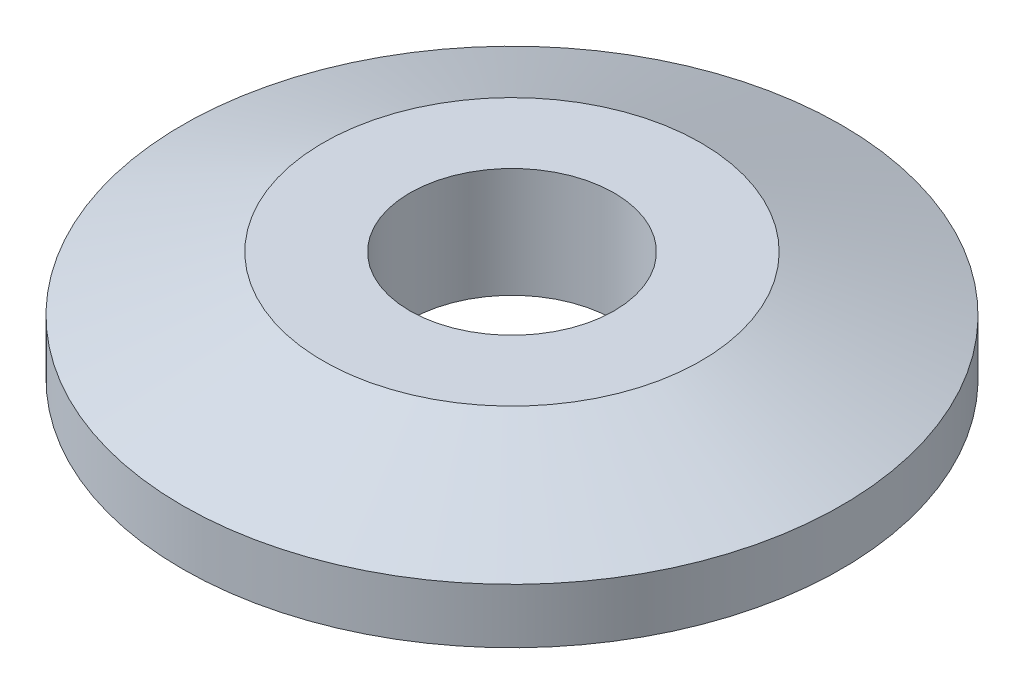
ISO-10303-21;
HEADER;
FILE_DESCRIPTION(('STEP AP214'),'2;1');
FILE_NAME('part.step','',(''),(''),'','','');
FILE_SCHEMA(('AUTOMOTIVE_DESIGN { 1 0 10303 214 1 1 1 1 }'));
ENDSEC;
DATA;
#1=APPLICATION_CONTEXT('core data for automotive mechanical design processes');
#2=APPLICATION_PROTOCOL_DEFINITION('international standard','automotive_design',2000,#1);
#3=PRODUCT_CONTEXT('',#1,'mechanical');
#4=PRODUCT('Part','Part','',(#3));
#5=PRODUCT_RELATED_PRODUCT_CATEGORY('part','',(#4));
#6=PRODUCT_DEFINITION_FORMATION('','',#4);
#7=PRODUCT_DEFINITION_CONTEXT('part definition',#1,'design');
#8=PRODUCT_DEFINITION('design','',#6,#7);
#9=PRODUCT_DEFINITION_SHAPE('','',#8);
#10=(LENGTH_UNIT() NAMED_UNIT(*) SI_UNIT(.MILLI.,.METRE.));
#11=(NAMED_UNIT(*) PLANE_ANGLE_UNIT() SI_UNIT($,.RADIAN.));
#12=(NAMED_UNIT(*) SI_UNIT($,.STERADIAN.) SOLID_ANGLE_UNIT());
#13=UNCERTAINTY_MEASURE_WITH_UNIT(LENGTH_MEASURE(1.E-05),#10,'distance_accuracy_value','');
#14=(GEOMETRIC_REPRESENTATION_CONTEXT(3) GLOBAL_UNCERTAINTY_ASSIGNED_CONTEXT((#13)) GLOBAL_UNIT_ASSIGNED_CONTEXT((#10,
#11,#12)) REPRESENTATION_CONTEXT('',''));
#15=CARTESIAN_POINT('',(0.,0.,0.));
#16=DIRECTION('',(0.,0.,1.));
#17=DIRECTION('',(1.,0.,0.));
#18=AXIS2_PLACEMENT_3D('',#15,#16,#17);
#19=CARTESIAN_POINT('',(0.,5.,0.));
#20=DIRECTION('',(0.,-1.,0.));
#21=DIRECTION('',(0.,0.,-1.));
#22=AXIS2_PLACEMENT_3D('',#19,#20,#21);
#23=CYLINDRICAL_SURFACE('',#22,15.);
#24=CARTESIAN_POINT('',(0.,0.,0.));
#25=DIRECTION('',(0.,1.,0.));
#26=DIRECTION('',(0.,0.,1.));
#27=AXIS2_PLACEMENT_3D('',#24,#25,#26);
#28=CIRCLE('',#27,15.);
#29=CARTESIAN_POINT('',(0.,0.,15.));
#30=VERTEX_POINT('',#29);
#31=EDGE_CURVE('E10',#30,#30,#28,.T.);
#32=ORIENTED_EDGE('',*,*,#31,.T.);
#33=EDGE_LOOP('',(#32));
#34=FACE_BOUND('',#33,.T.);
#35=CARTESIAN_POINT('',(0.,2.5,0.));
#36=DIRECTION('',(0.,-1.,0.));
#37=DIRECTION('',(0.,0.,-1.));
#38=AXIS2_PLACEMENT_3D('',#35,#36,#37);
#39=CIRCLE('',#38,15.);
#40=CARTESIAN_POINT('',(0.,2.5,-15.));
#41=VERTEX_POINT('',#40);
#42=EDGE_CURVE('E50',#41,#41,#39,.T.);
#43=ORIENTED_EDGE('',*,*,#42,.T.);
#44=EDGE_LOOP('',(#43));
#45=FACE_BOUND('',#44,.T.);
#46=ADVANCED_FACE('F31',(#34,#45),#23,.T.);
#47=CARTESIAN_POINT('',(0.,0.,0.));
#48=DIRECTION('',(0.,1.,0.));
#49=DIRECTION('',(0.,0.,1.));
#50=AXIS2_PLACEMENT_3D('',#47,#48,#49);
#51=PLANE('',#50);
#52=CARTESIAN_POINT('',(0.,0.,0.));
#53=DIRECTION('',(0.,-1.,0.));
#54=DIRECTION('',(0.,0.,-1.));
#55=AXIS2_PLACEMENT_3D('',#52,#53,#54);
#56=CIRCLE('',#55,8.6);
#57=CARTESIAN_POINT('',(0.,0.,-8.6));
#58=VERTEX_POINT('',#57);
#59=EDGE_CURVE('E41',#58,#58,#56,.T.);
#60=ORIENTED_EDGE('',*,*,#59,.F.);
#61=EDGE_LOOP('',(#60));
#62=FACE_BOUND('',#61,.T.);
#63=ORIENTED_EDGE('',*,*,#31,.F.);
#64=EDGE_LOOP('',(#63));
#65=FACE_BOUND('',#64,.T.);
#66=ADVANCED_FACE('F85',(#62,#65),#51,.F.);
#67=CARTESIAN_POINT('',(0.,2.5,0.));
#68=DIRECTION('',(0.,-1.,0.));
#69=DIRECTION('',(0.,0.,-1.));
#70=AXIS2_PLACEMENT_3D('',#67,#68,#69);
#71=CYLINDRICAL_SURFACE('',#70,8.6);
#72=CARTESIAN_POINT('',(0.,2.5,0.));
#73=DIRECTION('',(0.,-1.,0.));
#74=DIRECTION('',(0.,0.,-1.));
#75=AXIS2_PLACEMENT_3D('',#72,#73,#74);
#76=CIRCLE('',#75,8.6);
#77=CARTESIAN_POINT('',(0.,2.5,-8.6));
#78=VERTEX_POINT('',#77);
#79=EDGE_CURVE('E37',#78,#78,#76,.T.);
#80=ORIENTED_EDGE('',*,*,#79,.F.);
#81=EDGE_LOOP('',(#80));
#82=FACE_BOUND('',#81,.T.);
#83=ORIENTED_EDGE('',*,*,#59,.T.);
#84=EDGE_LOOP('',(#83));
#85=FACE_BOUND('',#84,.T.);
#86=ADVANCED_FACE('F89',(#82,#85),#71,.F.);
#87=CARTESIAN_POINT('',(0.,2.5,0.));
#88=DIRECTION('',(0.,-1.,0.));
#89=DIRECTION('',(0.,0.,-1.));
#90=AXIS2_PLACEMENT_3D('',#87,#88,#89);
#91=PLANE('',#90);
#92=CARTESIAN_POINT('',(0.,2.5,0.));
#93=DIRECTION('',(0.,-1.,0.));
#94=DIRECTION('',(0.,0.,-1.));
#95=AXIS2_PLACEMENT_3D('',#92,#93,#94);
#96=CIRCLE('',#95,7.5);
#97=CARTESIAN_POINT('',(0.,2.5,-7.5));
#98=VERTEX_POINT('',#97);
#99=EDGE_CURVE('E57',#98,#98,#96,.T.);
#100=ORIENTED_EDGE('',*,*,#99,.F.);
#101=EDGE_LOOP('',(#100));
#102=FACE_BOUND('',#101,.T.);
#103=ORIENTED_EDGE('',*,*,#79,.T.);
#104=EDGE_LOOP('',(#103));
#105=FACE_BOUND('',#104,.T.);
#106=ADVANCED_FACE('F97',(#102,#105),#91,.T.);
#107=CARTESIAN_POINT('',(0.,2.5,0.));
#108=DIRECTION('',(0.,-1.,0.));
#109=DIRECTION('',(0.,0.,-1.));
#110=AXIS2_PLACEMENT_3D('',#107,#108,#109);
#111=CONICAL_SURFACE('',#110,15.,1.19839788011814);
#112=CARTESIAN_POINT('',(0.,5.,0.));
#113=DIRECTION('',(0.,-1.,0.));
#114=DIRECTION('',(0.,0.,-1.));
#115=AXIS2_PLACEMENT_3D('',#112,#113,#114);
#116=CIRCLE('',#115,8.6);
#117=CARTESIAN_POINT('',(0.,5.,-8.6));
#118=VERTEX_POINT('',#117);
#119=EDGE_CURVE('E46',#118,#118,#116,.T.);
#120=ORIENTED_EDGE('',*,*,#119,.T.);
#121=EDGE_LOOP('',(#120));
#122=FACE_BOUND('',#121,.T.);
#123=ORIENTED_EDGE('',*,*,#42,.F.);
#124=EDGE_LOOP('',(#123));
#125=FACE_BOUND('',#124,.T.);
#126=ADVANCED_FACE('F94',(#122,#125),#111,.T.);
#127=CARTESIAN_POINT('',(0.,5.,0.));
#128=DIRECTION('',(0.,1.,0.));
#129=DIRECTION('',(0.,0.,1.));
#130=AXIS2_PLACEMENT_3D('',#127,#128,#129);
#131=PLANE('',#130);
#132=CARTESIAN_POINT('',(0.,5.,0.));
#133=DIRECTION('',(0.,1.,0.));
#134=DIRECTION('',(0.,0.,1.));
#135=AXIS2_PLACEMENT_3D('',#132,#133,#134);
#136=CIRCLE('',#135,4.65);
#137=CARTESIAN_POINT('',(0.,5.,4.65));
#138=VERTEX_POINT('',#137);
#139=EDGE_CURVE('E53',#138,#138,#136,.T.);
#140=ORIENTED_EDGE('',*,*,#139,.F.);
#141=EDGE_LOOP('',(#140));
#142=FACE_BOUND('',#141,.T.);
#143=ORIENTED_EDGE('',*,*,#119,.F.);
#144=EDGE_LOOP('',(#143));
#145=FACE_BOUND('',#144,.T.);
#146=ADVANCED_FACE('F96',(#142,#145),#131,.T.);
#147=CARTESIAN_POINT('',(0.,2.5,0.));
#148=DIRECTION('',(0.,1.,0.));
#149=DIRECTION('',(0.,0.,1.));
#150=AXIS2_PLACEMENT_3D('',#147,#148,#149);
#151=CYLINDRICAL_SURFACE('',#150,4.65);
#152=ORIENTED_EDGE('',*,*,#139,.T.);
#153=EDGE_LOOP('',(#152));
#154=FACE_BOUND('',#153,.T.);
#155=CARTESIAN_POINT('',(0.,0.,0.));
#156=DIRECTION('',(0.,1.,0.));
#157=DIRECTION('',(0.,0.,1.));
#158=AXIS2_PLACEMENT_3D('',#155,#156,#157);
#159=CIRCLE('',#158,4.65);
#160=CARTESIAN_POINT('',(0.,0.,4.65));
#161=VERTEX_POINT('',#160);
#162=EDGE_CURVE('E65',#161,#161,#159,.T.);
#163=ORIENTED_EDGE('',*,*,#162,.F.);
#164=EDGE_LOOP('',(#163));
#165=FACE_BOUND('',#164,.T.);
#166=ADVANCED_FACE('F105',(#154,#165),#151,.F.);
#167=CARTESIAN_POINT('',(0.,3.5,0.));
#168=DIRECTION('',(0.,-1.,0.));
#169=DIRECTION('',(0.,0.,-1.));
#170=AXIS2_PLACEMENT_3D('',#167,#168,#169);
#171=CYLINDRICAL_SURFACE('',#170,7.5);
#172=ORIENTED_EDGE('',*,*,#99,.T.);
#173=EDGE_LOOP('',(#172));
#174=FACE_BOUND('',#173,.T.);
#175=CARTESIAN_POINT('',(0.,3.5,0.));
#176=DIRECTION('',(0.,-1.,0.));
#177=DIRECTION('',(0.,0.,-1.));
#178=AXIS2_PLACEMENT_3D('',#175,#176,#177);
#179=CIRCLE('',#178,7.5);
#180=CARTESIAN_POINT('',(0.,3.5,-7.5));
#181=VERTEX_POINT('',#180);
#182=EDGE_CURVE('E56',#181,#181,#179,.T.);
#183=ORIENTED_EDGE('',*,*,#182,.F.);
#184=EDGE_LOOP('',(#183));
#185=FACE_BOUND('',#184,.T.);
#186=ADVANCED_FACE('F133',(#174,#185),#171,.F.);
#187=CARTESIAN_POINT('',(0.,3.5,0.));
#188=DIRECTION('',(0.,-1.,0.));
#189=DIRECTION('',(0.,0.,-1.));
#190=AXIS2_PLACEMENT_3D('',#187,#188,#189);
#191=PLANE('',#190);
#192=CARTESIAN_POINT('',(0.,3.5,0.));
#193=DIRECTION('',(0.,-1.,0.));
#194=DIRECTION('',(0.,0.,-1.));
#195=AXIS2_PLACEMENT_3D('',#192,#193,#194);
#196=CIRCLE('',#195,6.);
#197=CARTESIAN_POINT('',(0.,3.5,-6.));
#198=VERTEX_POINT('',#197);
#199=EDGE_CURVE('E60',#198,#198,#196,.T.);
#200=ORIENTED_EDGE('',*,*,#199,.F.);
#201=EDGE_LOOP('',(#200));
#202=FACE_BOUND('',#201,.T.);
#203=ORIENTED_EDGE('',*,*,#182,.T.);
#204=EDGE_LOOP('',(#203));
#205=FACE_BOUND('',#204,.T.);
#206=ADVANCED_FACE('F81',(#202,#205),#191,.T.);
#207=CARTESIAN_POINT('',(0.,3.5,0.));
#208=DIRECTION('',(0.,-1.,0.));
#209=DIRECTION('',(0.,0.,-1.));
#210=AXIS2_PLACEMENT_3D('',#207,#208,#209);
#211=CYLINDRICAL_SURFACE('',#210,6.);
#212=ORIENTED_EDGE('',*,*,#199,.T.);
#213=EDGE_LOOP('',(#212));
#214=FACE_BOUND('',#213,.T.);
#215=CARTESIAN_POINT('',(0.,0.,0.));
#216=DIRECTION('',(0.,1.,0.));
#217=DIRECTION('',(0.,0.,1.));
#218=AXIS2_PLACEMENT_3D('',#215,#216,#217);
#219=CIRCLE('',#218,6.);
#220=CARTESIAN_POINT('',(0.,0.,6.));
#221=VERTEX_POINT('',#220);
#222=EDGE_CURVE('E68',#221,#221,#219,.T.);
#223=ORIENTED_EDGE('',*,*,#222,.T.);
#224=EDGE_LOOP('',(#223));
#225=FACE_BOUND('',#224,.T.);
#226=ADVANCED_FACE('F72',(#214,#225),#211,.T.);
#227=CARTESIAN_POINT('',(0.,0.,0.));
#228=DIRECTION('',(0.,1.,0.));
#229=DIRECTION('',(0.,0.,1.));
#230=AXIS2_PLACEMENT_3D('',#227,#228,#229);
#231=PLANE('',#230);
#232=ORIENTED_EDGE('',*,*,#162,.T.);
#233=EDGE_LOOP('',(#232));
#234=FACE_BOUND('',#233,.T.);
#235=ORIENTED_EDGE('',*,*,#222,.F.);
#236=EDGE_LOOP('',(#235));
#237=FACE_BOUND('',#236,.T.);
#238=ADVANCED_FACE('F74',(#234,#237),#231,.F.);
#239=CLOSED_SHELL('',(#46,#66,#86,#106,#126,#146,#166,#186,#206,#226,#238));
#240=MANIFOLD_SOLID_BREP('B2',#239);
#241=ADVANCED_BREP_SHAPE_REPRESENTATION('',(#18,#240),#14);
#242=SHAPE_DEFINITION_REPRESENTATION(#9,#241);
ENDSEC;
END-ISO-10303-21;
